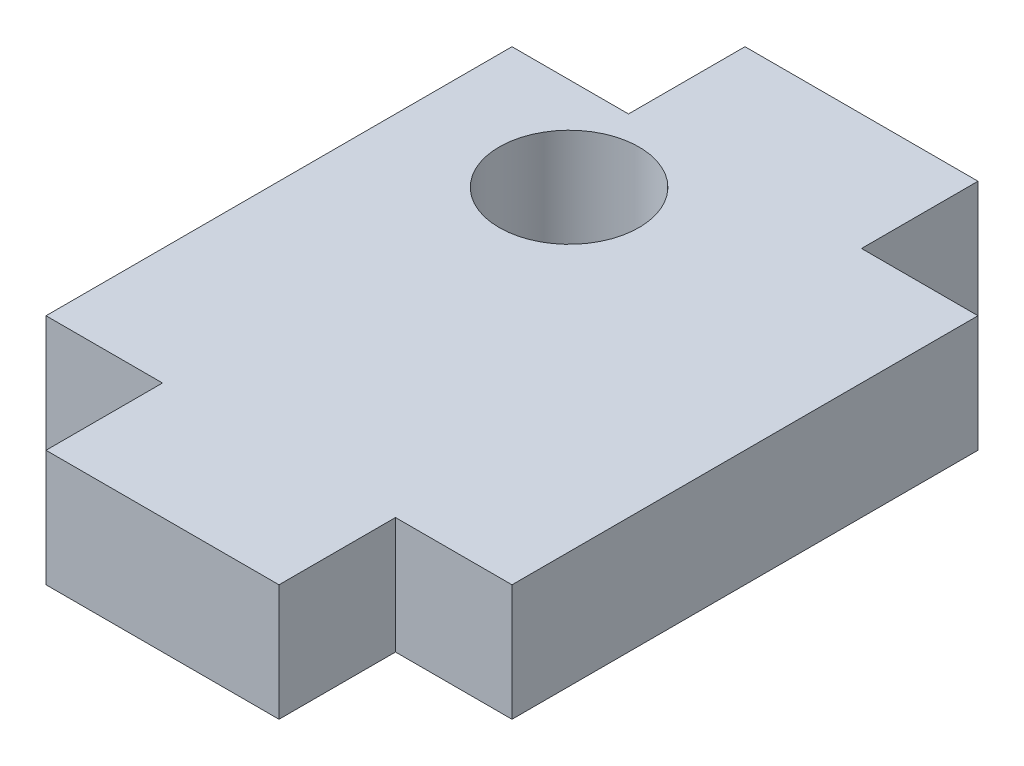
ISO-10303-21;
HEADER;
FILE_DESCRIPTION(('STEP AP214'),'2;1');
FILE_NAME('part.step','',(''),(''),'','','');
FILE_SCHEMA(('AUTOMOTIVE_DESIGN { 1 0 10303 214 1 1 1 1 }'));
ENDSEC;
DATA;
#1=APPLICATION_CONTEXT('core data for automotive mechanical design processes');
#2=APPLICATION_PROTOCOL_DEFINITION('international standard','automotive_design',2000,#1);
#3=PRODUCT_CONTEXT('',#1,'mechanical');
#4=PRODUCT('Part','Part','',(#3));
#5=PRODUCT_RELATED_PRODUCT_CATEGORY('part','',(#4));
#6=PRODUCT_DEFINITION_FORMATION('','',#4);
#7=PRODUCT_DEFINITION_CONTEXT('part definition',#1,'design');
#8=PRODUCT_DEFINITION('design','',#6,#7);
#9=PRODUCT_DEFINITION_SHAPE('','',#8);
#10=(LENGTH_UNIT() NAMED_UNIT(*) SI_UNIT(.MILLI.,.METRE.));
#11=(NAMED_UNIT(*) PLANE_ANGLE_UNIT() SI_UNIT($,.RADIAN.));
#12=(NAMED_UNIT(*) SI_UNIT($,.STERADIAN.) SOLID_ANGLE_UNIT());
#13=UNCERTAINTY_MEASURE_WITH_UNIT(LENGTH_MEASURE(1.E-05),#10,'distance_accuracy_value','');
#14=(GEOMETRIC_REPRESENTATION_CONTEXT(3) GLOBAL_UNCERTAINTY_ASSIGNED_CONTEXT((#13)) GLOBAL_UNIT_ASSIGNED_CONTEXT((#10,
#11,#12)) REPRESENTATION_CONTEXT('',''));
#15=CARTESIAN_POINT('',(0.,0.,0.));
#16=DIRECTION('',(0.,0.,1.));
#17=DIRECTION('',(1.,0.,0.));
#18=AXIS2_PLACEMENT_3D('',#15,#16,#17);
#19=CARTESIAN_POINT('',(0.,5.,0.));
#20=DIRECTION('',(0.,-1.,0.));
#21=DIRECTION('',(0.,0.,-1.));
#22=AXIS2_PLACEMENT_3D('',#19,#20,#21);
#23=PLANE('',#22);
#24=DIRECTION('',(0.,0.,1.));
#25=VECTOR('',#24,1.);
#26=CARTESIAN_POINT('',(0.,5.,0.));
#27=LINE('',#26,#25);
#28=CARTESIAN_POINT('',(0.,5.,-20.));
#29=VERTEX_POINT('',#28);
#30=CARTESIAN_POINT('',(0.,5.,0.));
#31=VERTEX_POINT('',#30);
#32=EDGE_CURVE('E181',#29,#31,#27,.T.);
#33=ORIENTED_EDGE('',*,*,#32,.T.);
#34=DIRECTION('',(1.,0.,0.));
#35=VECTOR('',#34,1.);
#36=CARTESIAN_POINT('',(0.,5.,0.));
#37=LINE('',#36,#35);
#38=CARTESIAN_POINT('',(5.,5.,0.));
#39=VERTEX_POINT('',#38);
#40=EDGE_CURVE('E109',#31,#39,#37,.T.);
#41=ORIENTED_EDGE('',*,*,#40,.T.);
#42=DIRECTION('',(0.,0.,1.));
#43=VECTOR('',#42,1.);
#44=CARTESIAN_POINT('',(5.,5.,0.));
#45=LINE('',#44,#43);
#46=CARTESIAN_POINT('',(5.,5.,5.));
#47=VERTEX_POINT('',#46);
#48=EDGE_CURVE('E208',#39,#47,#45,.T.);
#49=ORIENTED_EDGE('',*,*,#48,.T.);
#50=DIRECTION('',(1.,0.,0.));
#51=VECTOR('',#50,1.);
#52=CARTESIAN_POINT('',(5.,5.,5.));
#53=LINE('',#52,#51);
#54=CARTESIAN_POINT('',(15.,5.,5.));
#55=VERTEX_POINT('',#54);
#56=EDGE_CURVE('E227',#47,#55,#53,.T.);
#57=ORIENTED_EDGE('',*,*,#56,.T.);
#58=DIRECTION('',(0.,0.,-1.));
#59=VECTOR('',#58,1.);
#60=CARTESIAN_POINT('',(15.,5.,0.));
#61=LINE('',#60,#59);
#62=CARTESIAN_POINT('',(15.,5.,0.));
#63=VERTEX_POINT('',#62);
#64=EDGE_CURVE('E224',#55,#63,#61,.T.);
#65=ORIENTED_EDGE('',*,*,#64,.T.);
#66=DIRECTION('',(1.,0.,0.));
#67=VECTOR('',#66,1.);
#68=CARTESIAN_POINT('',(15.,5.,0.));
#69=LINE('',#68,#67);
#70=CARTESIAN_POINT('',(20.,5.,0.));
#71=VERTEX_POINT('',#70);
#72=EDGE_CURVE('E226',#63,#71,#69,.T.);
#73=ORIENTED_EDGE('',*,*,#72,.T.);
#74=DIRECTION('',(0.,0.,-1.));
#75=VECTOR('',#74,1.);
#76=CARTESIAN_POINT('',(20.,5.,0.));
#77=LINE('',#76,#75);
#78=CARTESIAN_POINT('',(20.,5.,-20.));
#79=VERTEX_POINT('',#78);
#80=EDGE_CURVE('E229',#71,#79,#77,.T.);
#81=ORIENTED_EDGE('',*,*,#80,.T.);
#82=DIRECTION('',(-1.,0.,0.));
#83=VECTOR('',#82,1.);
#84=CARTESIAN_POINT('',(15.,5.,-20.));
#85=LINE('',#84,#83);
#86=CARTESIAN_POINT('',(15.,5.,-20.));
#87=VERTEX_POINT('',#86);
#88=EDGE_CURVE('E235',#79,#87,#85,.T.);
#89=ORIENTED_EDGE('',*,*,#88,.T.);
#90=DIRECTION('',(0.,0.,-1.));
#91=VECTOR('',#90,1.);
#92=CARTESIAN_POINT('',(15.,5.,-20.));
#93=LINE('',#92,#91);
#94=CARTESIAN_POINT('',(15.,5.,-25.));
#95=VERTEX_POINT('',#94);
#96=EDGE_CURVE('E140',#87,#95,#93,.T.);
#97=ORIENTED_EDGE('',*,*,#96,.T.);
#98=DIRECTION('',(-1.,0.,0.));
#99=VECTOR('',#98,1.);
#100=CARTESIAN_POINT('',(5.,5.,-25.));
#101=LINE('',#100,#99);
#102=CARTESIAN_POINT('',(5.,5.,-25.));
#103=VERTEX_POINT('',#102);
#104=EDGE_CURVE('E134',#95,#103,#101,.T.);
#105=ORIENTED_EDGE('',*,*,#104,.T.);
#106=DIRECTION('',(0.,0.,1.));
#107=VECTOR('',#106,1.);
#108=CARTESIAN_POINT('',(5.,5.,-20.));
#109=LINE('',#108,#107);
#110=CARTESIAN_POINT('',(5.,5.,-20.));
#111=VERTEX_POINT('',#110);
#112=EDGE_CURVE('E138',#103,#111,#109,.T.);
#113=ORIENTED_EDGE('',*,*,#112,.T.);
#114=DIRECTION('',(-1.,0.,0.));
#115=VECTOR('',#114,1.);
#116=CARTESIAN_POINT('',(0.,5.,-20.));
#117=LINE('',#116,#115);
#118=EDGE_CURVE('E54',#111,#29,#117,.T.);
#119=ORIENTED_EDGE('',*,*,#118,.T.);
#120=EDGE_LOOP('',(#33,#41,#49,#57,#65,#73,#81,#89,#97,#105,#113,#119));
#121=FACE_BOUND('',#120,.T.);
#122=CARTESIAN_POINT('',(6.45,5.,-16.));
#123=DIRECTION('',(0.,1.,0.));
#124=DIRECTION('',(0.,0.,1.));
#125=AXIS2_PLACEMENT_3D('',#122,#123,#124);
#126=CIRCLE('',#125,3.);
#127=CARTESIAN_POINT('',(6.45,5.,-13.));
#128=VERTEX_POINT('',#127);
#129=EDGE_CURVE('E162',#128,#128,#126,.T.);
#130=ORIENTED_EDGE('',*,*,#129,.F.);
#131=EDGE_LOOP('',(#130));
#132=FACE_BOUND('',#131,.T.);
#133=ADVANCED_FACE('F37',(#121,#132),#23,.F.);
#134=CARTESIAN_POINT('',(0.,0.,0.));
#135=DIRECTION('',(0.,-1.,0.));
#136=DIRECTION('',(0.,0.,-1.));
#137=AXIS2_PLACEMENT_3D('',#134,#135,#136);
#138=PLANE('',#137);
#139=DIRECTION('',(0.,0.,1.));
#140=VECTOR('',#139,1.);
#141=CARTESIAN_POINT('',(0.,0.,0.));
#142=LINE('',#141,#140);
#143=CARTESIAN_POINT('',(0.,0.,-20.));
#144=VERTEX_POINT('',#143);
#145=CARTESIAN_POINT('',(0.,0.,0.));
#146=VERTEX_POINT('',#145);
#147=EDGE_CURVE('E158',#144,#146,#142,.T.);
#148=ORIENTED_EDGE('',*,*,#147,.F.);
#149=DIRECTION('',(-1.,0.,0.));
#150=VECTOR('',#149,1.);
#151=CARTESIAN_POINT('',(0.,0.,-20.));
#152=LINE('',#151,#150);
#153=CARTESIAN_POINT('',(5.,0.,-20.));
#154=VERTEX_POINT('',#153);
#155=EDGE_CURVE('E101',#154,#144,#152,.T.);
#156=ORIENTED_EDGE('',*,*,#155,.F.);
#157=DIRECTION('',(0.,0.,1.));
#158=VECTOR('',#157,1.);
#159=CARTESIAN_POINT('',(5.,0.,-20.));
#160=LINE('',#159,#158);
#161=CARTESIAN_POINT('',(5.,0.,-25.));
#162=VERTEX_POINT('',#161);
#163=EDGE_CURVE('E95',#162,#154,#160,.T.);
#164=ORIENTED_EDGE('',*,*,#163,.F.);
#165=DIRECTION('',(-1.,0.,0.));
#166=VECTOR('',#165,1.);
#167=CARTESIAN_POINT('',(5.,0.,-25.));
#168=LINE('',#167,#166);
#169=CARTESIAN_POINT('',(15.,0.,-25.));
#170=VERTEX_POINT('',#169);
#171=EDGE_CURVE('E148',#170,#162,#168,.T.);
#172=ORIENTED_EDGE('',*,*,#171,.F.);
#173=DIRECTION('',(0.,0.,-1.));
#174=VECTOR('',#173,1.);
#175=CARTESIAN_POINT('',(15.,0.,-20.));
#176=LINE('',#175,#174);
#177=CARTESIAN_POINT('',(15.,0.,-20.));
#178=VERTEX_POINT('',#177);
#179=EDGE_CURVE('E176',#178,#170,#176,.T.);
#180=ORIENTED_EDGE('',*,*,#179,.F.);
#181=DIRECTION('',(-1.,0.,0.));
#182=VECTOR('',#181,1.);
#183=CARTESIAN_POINT('',(15.,0.,-20.));
#184=LINE('',#183,#182);
#185=CARTESIAN_POINT('',(20.,0.,-20.));
#186=VERTEX_POINT('',#185);
#187=EDGE_CURVE('E174',#186,#178,#184,.T.);
#188=ORIENTED_EDGE('',*,*,#187,.F.);
#189=DIRECTION('',(0.,0.,-1.));
#190=VECTOR('',#189,1.);
#191=CARTESIAN_POINT('',(20.,0.,0.));
#192=LINE('',#191,#190);
#193=CARTESIAN_POINT('',(20.,0.,0.));
#194=VERTEX_POINT('',#193);
#195=EDGE_CURVE('E172',#194,#186,#192,.T.);
#196=ORIENTED_EDGE('',*,*,#195,.F.);
#197=DIRECTION('',(1.,0.,0.));
#198=VECTOR('',#197,1.);
#199=CARTESIAN_POINT('',(15.,0.,0.));
#200=LINE('',#199,#198);
#201=CARTESIAN_POINT('',(15.,0.,0.));
#202=VERTEX_POINT('',#201);
#203=EDGE_CURVE('E170',#202,#194,#200,.T.);
#204=ORIENTED_EDGE('',*,*,#203,.F.);
#205=DIRECTION('',(0.,0.,-1.));
#206=VECTOR('',#205,1.);
#207=CARTESIAN_POINT('',(15.,0.,0.));
#208=LINE('',#207,#206);
#209=CARTESIAN_POINT('',(15.,0.,5.));
#210=VERTEX_POINT('',#209);
#211=EDGE_CURVE('E168',#210,#202,#208,.T.);
#212=ORIENTED_EDGE('',*,*,#211,.F.);
#213=DIRECTION('',(1.,0.,0.));
#214=VECTOR('',#213,1.);
#215=CARTESIAN_POINT('',(5.,0.,5.));
#216=LINE('',#215,#214);
#217=CARTESIAN_POINT('',(5.,0.,5.));
#218=VERTEX_POINT('',#217);
#219=EDGE_CURVE('E166',#218,#210,#216,.T.);
#220=ORIENTED_EDGE('',*,*,#219,.F.);
#221=DIRECTION('',(0.,0.,1.));
#222=VECTOR('',#221,1.);
#223=CARTESIAN_POINT('',(5.,0.,0.));
#224=LINE('',#223,#222);
#225=CARTESIAN_POINT('',(5.,0.,0.));
#226=VERTEX_POINT('',#225);
#227=EDGE_CURVE('E164',#226,#218,#224,.T.);
#228=ORIENTED_EDGE('',*,*,#227,.F.);
#229=DIRECTION('',(1.,0.,0.));
#230=VECTOR('',#229,1.);
#231=CARTESIAN_POINT('',(0.,0.,0.));
#232=LINE('',#231,#230);
#233=EDGE_CURVE('E161',#146,#226,#232,.T.);
#234=ORIENTED_EDGE('',*,*,#233,.F.);
#235=EDGE_LOOP('',(#148,#156,#164,#172,#180,#188,#196,#204,#212,#220,#228,#234));
#236=FACE_BOUND('',#235,.T.);
#237=CARTESIAN_POINT('',(6.45,0.,-16.));
#238=DIRECTION('',(0.,1.,0.));
#239=DIRECTION('',(0.,0.,1.));
#240=AXIS2_PLACEMENT_3D('',#237,#238,#239);
#241=CIRCLE('',#240,3.);
#242=CARTESIAN_POINT('',(6.45,0.,-13.));
#243=VERTEX_POINT('',#242);
#244=EDGE_CURVE('E382',#243,#243,#241,.T.);
#245=ORIENTED_EDGE('',*,*,#244,.T.);
#246=EDGE_LOOP('',(#245));
#247=FACE_BOUND('',#246,.T.);
#248=ADVANCED_FACE('F212',(#236,#247),#138,.T.);
#249=CARTESIAN_POINT('',(0.,5.,0.));
#250=DIRECTION('',(1.,0.,0.));
#251=DIRECTION('',(0.,0.,-1.));
#252=AXIS2_PLACEMENT_3D('',#249,#250,#251);
#253=PLANE('',#252);
#254=ORIENTED_EDGE('',*,*,#147,.T.);
#255=DIRECTION('',(0.,-1.,0.));
#256=VECTOR('',#255,1.);
#257=CARTESIAN_POINT('',(0.,5.,0.));
#258=LINE('',#257,#256);
#259=EDGE_CURVE('E11',#31,#146,#258,.T.);
#260=ORIENTED_EDGE('',*,*,#259,.F.);
#261=ORIENTED_EDGE('',*,*,#32,.F.);
#262=DIRECTION('',(0.,-1.,0.));
#263=VECTOR('',#262,1.);
#264=CARTESIAN_POINT('',(0.,5.,-20.));
#265=LINE('',#264,#263);
#266=EDGE_CURVE('E154',#29,#144,#265,.T.);
#267=ORIENTED_EDGE('',*,*,#266,.T.);
#268=EDGE_LOOP('',(#254,#260,#261,#267));
#269=FACE_BOUND('',#268,.T.);
#270=ADVANCED_FACE('F39',(#269),#253,.F.);
#271=CARTESIAN_POINT('',(0.,5.,0.));
#272=DIRECTION('',(0.,0.,-1.));
#273=DIRECTION('',(-1.,0.,0.));
#274=AXIS2_PLACEMENT_3D('',#271,#272,#273);
#275=PLANE('',#274);
#276=ORIENTED_EDGE('',*,*,#233,.T.);
#277=DIRECTION('',(0.,-1.,0.));
#278=VECTOR('',#277,1.);
#279=CARTESIAN_POINT('',(5.,5.,0.));
#280=LINE('',#279,#278);
#281=EDGE_CURVE('E46',#39,#226,#280,.T.);
#282=ORIENTED_EDGE('',*,*,#281,.F.);
#283=ORIENTED_EDGE('',*,*,#40,.F.);
#284=ORIENTED_EDGE('',*,*,#259,.T.);
#285=EDGE_LOOP('',(#276,#282,#283,#284));
#286=FACE_BOUND('',#285,.T.);
#287=ADVANCED_FACE('F269',(#286),#275,.F.);
#288=CARTESIAN_POINT('',(5.,5.,0.));
#289=DIRECTION('',(1.,0.,0.));
#290=DIRECTION('',(0.,0.,-1.));
#291=AXIS2_PLACEMENT_3D('',#288,#289,#290);
#292=PLANE('',#291);
#293=ORIENTED_EDGE('',*,*,#227,.T.);
#294=DIRECTION('',(0.,-1.,0.));
#295=VECTOR('',#294,1.);
#296=CARTESIAN_POINT('',(5.,5.,5.));
#297=LINE('',#296,#295);
#298=EDGE_CURVE('E200',#47,#218,#297,.T.);
#299=ORIENTED_EDGE('',*,*,#298,.F.);
#300=ORIENTED_EDGE('',*,*,#48,.F.);
#301=ORIENTED_EDGE('',*,*,#281,.T.);
#302=EDGE_LOOP('',(#293,#299,#300,#301));
#303=FACE_BOUND('',#302,.T.);
#304=ADVANCED_FACE('F206',(#303),#292,.F.);
#305=CARTESIAN_POINT('',(5.,5.,5.));
#306=DIRECTION('',(0.,0.,-1.));
#307=DIRECTION('',(-1.,0.,0.));
#308=AXIS2_PLACEMENT_3D('',#305,#306,#307);
#309=PLANE('',#308);
#310=ORIENTED_EDGE('',*,*,#219,.T.);
#311=DIRECTION('',(0.,-1.,0.));
#312=VECTOR('',#311,1.);
#313=CARTESIAN_POINT('',(15.,5.,5.));
#314=LINE('',#313,#312);
#315=EDGE_CURVE('E197',#55,#210,#314,.T.);
#316=ORIENTED_EDGE('',*,*,#315,.F.);
#317=ORIENTED_EDGE('',*,*,#56,.F.);
#318=ORIENTED_EDGE('',*,*,#298,.T.);
#319=EDGE_LOOP('',(#310,#316,#317,#318));
#320=FACE_BOUND('',#319,.T.);
#321=ADVANCED_FACE('F218',(#320),#309,.F.);
#322=CARTESIAN_POINT('',(15.,5.,0.));
#323=DIRECTION('',(-1.,0.,0.));
#324=DIRECTION('',(0.,0.,1.));
#325=AXIS2_PLACEMENT_3D('',#322,#323,#324);
#326=PLANE('',#325);
#327=ORIENTED_EDGE('',*,*,#211,.T.);
#328=DIRECTION('',(0.,-1.,0.));
#329=VECTOR('',#328,1.);
#330=CARTESIAN_POINT('',(15.,5.,0.));
#331=LINE('',#330,#329);
#332=EDGE_CURVE('E194',#63,#202,#331,.T.);
#333=ORIENTED_EDGE('',*,*,#332,.F.);
#334=ORIENTED_EDGE('',*,*,#64,.F.);
#335=ORIENTED_EDGE('',*,*,#315,.T.);
#336=EDGE_LOOP('',(#327,#333,#334,#335));
#337=FACE_BOUND('',#336,.T.);
#338=ADVANCED_FACE('F222',(#337),#326,.F.);
#339=CARTESIAN_POINT('',(15.,5.,0.));
#340=DIRECTION('',(0.,0.,-1.));
#341=DIRECTION('',(-1.,0.,0.));
#342=AXIS2_PLACEMENT_3D('',#339,#340,#341);
#343=PLANE('',#342);
#344=ORIENTED_EDGE('',*,*,#203,.T.);
#345=DIRECTION('',(0.,-1.,0.));
#346=VECTOR('',#345,1.);
#347=CARTESIAN_POINT('',(20.,5.,0.));
#348=LINE('',#347,#346);
#349=EDGE_CURVE('E191',#71,#194,#348,.T.);
#350=ORIENTED_EDGE('',*,*,#349,.F.);
#351=ORIENTED_EDGE('',*,*,#72,.F.);
#352=ORIENTED_EDGE('',*,*,#332,.T.);
#353=EDGE_LOOP('',(#344,#350,#351,#352));
#354=FACE_BOUND('',#353,.T.);
#355=ADVANCED_FACE('F282',(#354),#343,.F.);
#356=CARTESIAN_POINT('',(20.,5.,0.));
#357=DIRECTION('',(-1.,0.,0.));
#358=DIRECTION('',(0.,0.,1.));
#359=AXIS2_PLACEMENT_3D('',#356,#357,#358);
#360=PLANE('',#359);
#361=ORIENTED_EDGE('',*,*,#195,.T.);
#362=DIRECTION('',(0.,-1.,0.));
#363=VECTOR('',#362,1.);
#364=CARTESIAN_POINT('',(20.,5.,-20.));
#365=LINE('',#364,#363);
#366=EDGE_CURVE('E188',#79,#186,#365,.T.);
#367=ORIENTED_EDGE('',*,*,#366,.F.);
#368=ORIENTED_EDGE('',*,*,#80,.F.);
#369=ORIENTED_EDGE('',*,*,#349,.T.);
#370=EDGE_LOOP('',(#361,#367,#368,#369));
#371=FACE_BOUND('',#370,.T.);
#372=ADVANCED_FACE('F285',(#371),#360,.F.);
#373=CARTESIAN_POINT('',(15.,5.,-20.));
#374=DIRECTION('',(0.,0.,1.));
#375=DIRECTION('',(1.,0.,0.));
#376=AXIS2_PLACEMENT_3D('',#373,#374,#375);
#377=PLANE('',#376);
#378=ORIENTED_EDGE('',*,*,#187,.T.);
#379=DIRECTION('',(0.,-1.,0.));
#380=VECTOR('',#379,1.);
#381=CARTESIAN_POINT('',(15.,5.,-20.));
#382=LINE('',#381,#380);
#383=EDGE_CURVE('E185',#87,#178,#382,.T.);
#384=ORIENTED_EDGE('',*,*,#383,.F.);
#385=ORIENTED_EDGE('',*,*,#88,.F.);
#386=ORIENTED_EDGE('',*,*,#366,.T.);
#387=EDGE_LOOP('',(#378,#384,#385,#386));
#388=FACE_BOUND('',#387,.T.);
#389=ADVANCED_FACE('F241',(#388),#377,.F.);
#390=CARTESIAN_POINT('',(15.,5.,-20.));
#391=DIRECTION('',(-1.,0.,0.));
#392=DIRECTION('',(0.,0.,1.));
#393=AXIS2_PLACEMENT_3D('',#390,#391,#392);
#394=PLANE('',#393);
#395=ORIENTED_EDGE('',*,*,#179,.T.);
#396=DIRECTION('',(0.,-1.,0.));
#397=VECTOR('',#396,1.);
#398=CARTESIAN_POINT('',(15.,5.,-25.));
#399=LINE('',#398,#397);
#400=EDGE_CURVE('E149',#95,#170,#399,.T.);
#401=ORIENTED_EDGE('',*,*,#400,.F.);
#402=ORIENTED_EDGE('',*,*,#96,.F.);
#403=ORIENTED_EDGE('',*,*,#383,.T.);
#404=EDGE_LOOP('',(#395,#401,#402,#403));
#405=FACE_BOUND('',#404,.T.);
#406=ADVANCED_FACE('F245',(#405),#394,.F.);
#407=CARTESIAN_POINT('',(5.,5.,-25.));
#408=DIRECTION('',(0.,0.,1.));
#409=DIRECTION('',(1.,0.,0.));
#410=AXIS2_PLACEMENT_3D('',#407,#408,#409);
#411=PLANE('',#410);
#412=ORIENTED_EDGE('',*,*,#171,.T.);
#413=DIRECTION('',(0.,-1.,0.));
#414=VECTOR('',#413,1.);
#415=CARTESIAN_POINT('',(5.,5.,-25.));
#416=LINE('',#415,#414);
#417=EDGE_CURVE('E145',#103,#162,#416,.T.);
#418=ORIENTED_EDGE('',*,*,#417,.F.);
#419=ORIENTED_EDGE('',*,*,#104,.F.);
#420=ORIENTED_EDGE('',*,*,#400,.T.);
#421=EDGE_LOOP('',(#412,#418,#419,#420));
#422=FACE_BOUND('',#421,.T.);
#423=ADVANCED_FACE('F146',(#422),#411,.F.);
#424=CARTESIAN_POINT('',(5.,5.,-20.));
#425=DIRECTION('',(1.,0.,0.));
#426=DIRECTION('',(0.,0.,-1.));
#427=AXIS2_PLACEMENT_3D('',#424,#425,#426);
#428=PLANE('',#427);
#429=ORIENTED_EDGE('',*,*,#163,.T.);
#430=DIRECTION('',(0.,-1.,0.));
#431=VECTOR('',#430,1.);
#432=CARTESIAN_POINT('',(5.,5.,-20.));
#433=LINE('',#432,#431);
#434=EDGE_CURVE('E150',#111,#154,#433,.T.);
#435=ORIENTED_EDGE('',*,*,#434,.F.);
#436=ORIENTED_EDGE('',*,*,#112,.F.);
#437=ORIENTED_EDGE('',*,*,#417,.T.);
#438=EDGE_LOOP('',(#429,#435,#436,#437));
#439=FACE_BOUND('',#438,.T.);
#440=ADVANCED_FACE('F152',(#439),#428,.F.);
#441=CARTESIAN_POINT('',(0.,5.,-20.));
#442=DIRECTION('',(0.,0.,1.));
#443=DIRECTION('',(1.,0.,0.));
#444=AXIS2_PLACEMENT_3D('',#441,#442,#443);
#445=PLANE('',#444);
#446=ORIENTED_EDGE('',*,*,#155,.T.);
#447=ORIENTED_EDGE('',*,*,#266,.F.);
#448=ORIENTED_EDGE('',*,*,#118,.F.);
#449=ORIENTED_EDGE('',*,*,#434,.T.);
#450=EDGE_LOOP('',(#446,#447,#448,#449));
#451=FACE_BOUND('',#450,.T.);
#452=ADVANCED_FACE('F249',(#451),#445,.F.);
#453=CARTESIAN_POINT('',(6.45,5.,-16.));
#454=DIRECTION('',(0.,-1.,0.));
#455=DIRECTION('',(0.,0.,-1.));
#456=AXIS2_PLACEMENT_3D('',#453,#454,#455);
#457=CYLINDRICAL_SURFACE('',#456,3.);
#458=ORIENTED_EDGE('',*,*,#129,.T.);
#459=EDGE_LOOP('',(#458));
#460=FACE_BOUND('',#459,.T.);
#461=ORIENTED_EDGE('',*,*,#244,.F.);
#462=EDGE_LOOP('',(#461));
#463=FACE_BOUND('',#462,.T.);
#464=ADVANCED_FACE('F251',(#460,#463),#457,.F.);
#465=CLOSED_SHELL('',(#133,#248,#270,#287,#304,#321,#338,#355,#372,#389,#406,#423,#440,#452,#464));
#466=MANIFOLD_SOLID_BREP('B2',#465);
#467=ADVANCED_BREP_SHAPE_REPRESENTATION('',(#18,#466),#14);
#468=SHAPE_DEFINITION_REPRESENTATION(#9,#467);
ENDSEC;
END-ISO-10303-21;
